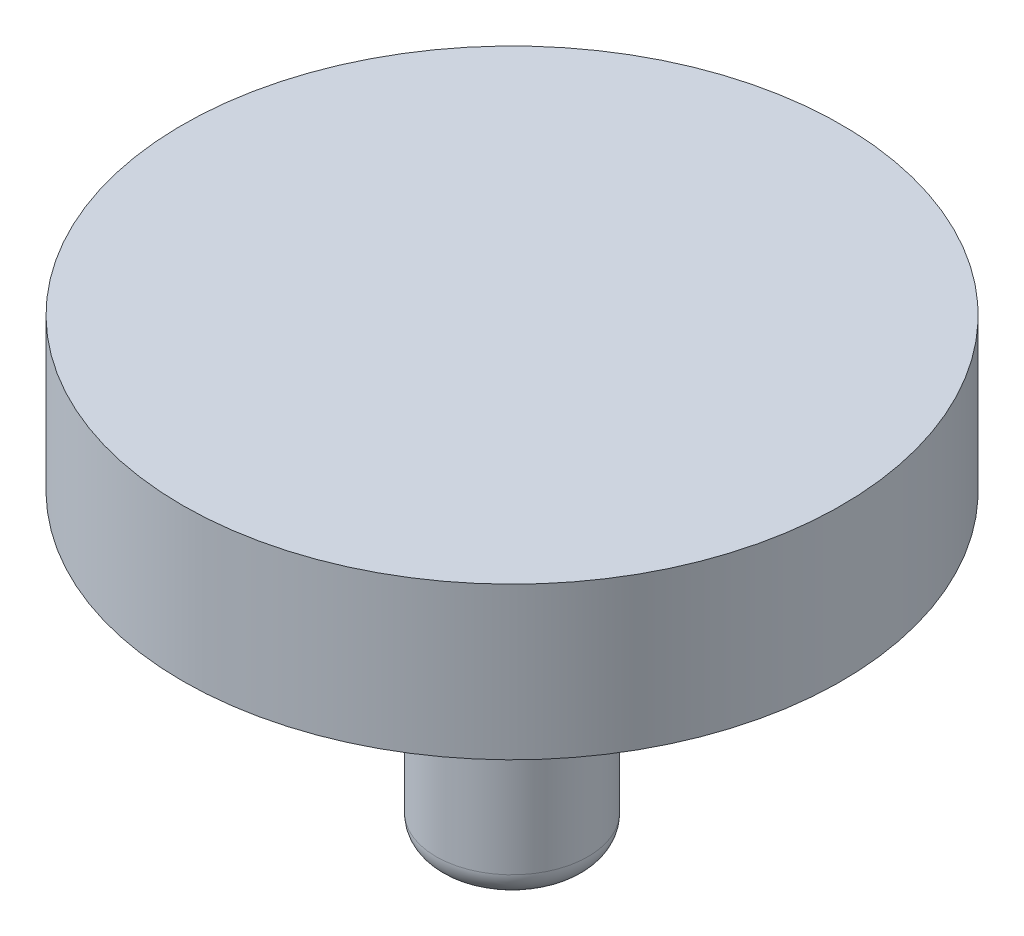
ISO-10303-21;
HEADER;
FILE_DESCRIPTION(('STEP AP214'),'2;1');
FILE_NAME('part.step','',(''),(''),'','','');
FILE_SCHEMA(('AUTOMOTIVE_DESIGN { 1 0 10303 214 1 1 1 1 }'));
ENDSEC;
DATA;
#1=APPLICATION_CONTEXT('core data for automotive mechanical design processes');
#2=APPLICATION_PROTOCOL_DEFINITION('international standard','automotive_design',2000,#1);
#3=PRODUCT_CONTEXT('',#1,'mechanical');
#4=PRODUCT('Part','Part','',(#3));
#5=PRODUCT_RELATED_PRODUCT_CATEGORY('part','',(#4));
#6=PRODUCT_DEFINITION_FORMATION('','',#4);
#7=PRODUCT_DEFINITION_CONTEXT('part definition',#1,'design');
#8=PRODUCT_DEFINITION('design','',#6,#7);
#9=PRODUCT_DEFINITION_SHAPE('','',#8);
#10=(LENGTH_UNIT() NAMED_UNIT(*) SI_UNIT(.MILLI.,.METRE.));
#11=(NAMED_UNIT(*) PLANE_ANGLE_UNIT() SI_UNIT($,.RADIAN.));
#12=(NAMED_UNIT(*) SI_UNIT($,.STERADIAN.) SOLID_ANGLE_UNIT());
#13=UNCERTAINTY_MEASURE_WITH_UNIT(LENGTH_MEASURE(1.E-05),#10,'distance_accuracy_value','');
#14=(GEOMETRIC_REPRESENTATION_CONTEXT(3) GLOBAL_UNCERTAINTY_ASSIGNED_CONTEXT((#13)) GLOBAL_UNIT_ASSIGNED_CONTEXT((#10,
#11,#12)) REPRESENTATION_CONTEXT('',''));
#15=CARTESIAN_POINT('',(0.,0.,0.));
#16=DIRECTION('',(0.,0.,1.));
#17=DIRECTION('',(1.,0.,0.));
#18=AXIS2_PLACEMENT_3D('',#15,#16,#17);
#19=CARTESIAN_POINT('',(0.,3.,0.));
#20=DIRECTION('',(0.,-1.,0.));
#21=DIRECTION('',(0.,0.,-1.));
#22=AXIS2_PLACEMENT_3D('',#19,#20,#21);
#23=CYLINDRICAL_SURFACE('',#22,6.5);
#24=CARTESIAN_POINT('',(0.,3.,0.));
#25=DIRECTION('',(0.,1.,0.));
#26=DIRECTION('',(0.,0.,1.));
#27=AXIS2_PLACEMENT_3D('',#24,#25,#26);
#28=CIRCLE('',#27,6.5);
#29=CARTESIAN_POINT('',(0.,3.,6.5));
#30=VERTEX_POINT('',#29);
#31=EDGE_CURVE('E50',#30,#30,#28,.T.);
#32=ORIENTED_EDGE('',*,*,#31,.F.);
#33=EDGE_LOOP('',(#32));
#34=FACE_BOUND('',#33,.T.);
#35=CARTESIAN_POINT('',(0.,0.,0.));
#36=DIRECTION('',(0.,1.,0.));
#37=DIRECTION('',(0.,0.,1.));
#38=AXIS2_PLACEMENT_3D('',#35,#36,#37);
#39=CIRCLE('',#38,6.5);
#40=CARTESIAN_POINT('',(0.,0.,6.5));
#41=VERTEX_POINT('',#40);
#42=EDGE_CURVE('E55',#41,#41,#39,.T.);
#43=ORIENTED_EDGE('',*,*,#42,.T.);
#44=EDGE_LOOP('',(#43));
#45=FACE_BOUND('',#44,.T.);
#46=ADVANCED_FACE('F37',(#34,#45),#23,.T.);
#47=CARTESIAN_POINT('',(0.,3.,0.));
#48=DIRECTION('',(0.,1.,0.));
#49=DIRECTION('',(0.,0.,1.));
#50=AXIS2_PLACEMENT_3D('',#47,#48,#49);
#51=PLANE('',#50);
#52=ORIENTED_EDGE('',*,*,#31,.T.);
#53=EDGE_LOOP('',(#52));
#54=FACE_BOUND('',#53,.T.);
#55=ADVANCED_FACE('F78',(#54),#51,.T.);
#56=CARTESIAN_POINT('',(0.,0.,0.));
#57=DIRECTION('',(0.,1.,0.));
#58=DIRECTION('',(0.,0.,1.));
#59=AXIS2_PLACEMENT_3D('',#56,#57,#58);
#60=PLANE('',#59);
#61=CARTESIAN_POINT('',(0.,0.,0.));
#62=DIRECTION('',(0.,1.,0.));
#63=DIRECTION('',(0.,0.,1.));
#64=AXIS2_PLACEMENT_3D('',#61,#62,#63);
#65=CIRCLE('',#64,1.5);
#66=CARTESIAN_POINT('',(0.,0.,1.5));
#67=VERTEX_POINT('',#66);
#68=EDGE_CURVE('E60',#67,#67,#65,.T.);
#69=ORIENTED_EDGE('',*,*,#68,.T.);
#70=EDGE_LOOP('',(#69));
#71=FACE_BOUND('',#70,.T.);
#72=ORIENTED_EDGE('',*,*,#42,.F.);
#73=EDGE_LOOP('',(#72));
#74=FACE_BOUND('',#73,.T.);
#75=ADVANCED_FACE('F66',(#71,#74),#60,.F.);
#76=CARTESIAN_POINT('',(0.,-6.,0.));
#77=DIRECTION('',(0.,1.,0.));
#78=DIRECTION('',(0.,0.,1.));
#79=AXIS2_PLACEMENT_3D('',#76,#77,#78);
#80=CYLINDRICAL_SURFACE('',#79,1.5);
#81=CARTESIAN_POINT('',(0.,-5.5,0.));
#82=DIRECTION('',(0.,1.,0.));
#83=DIRECTION('',(0.,0.,1.));
#84=AXIS2_PLACEMENT_3D('',#81,#82,#83);
#85=CIRCLE('',#84,1.5);
#86=CARTESIAN_POINT('',(0.,-5.5,1.5));
#87=VERTEX_POINT('',#86);
#88=EDGE_CURVE('E45',#87,#87,#85,.T.);
#89=ORIENTED_EDGE('',*,*,#88,.T.);
#90=EDGE_LOOP('',(#89));
#91=FACE_BOUND('',#90,.T.);
#92=ORIENTED_EDGE('',*,*,#68,.F.);
#93=EDGE_LOOP('',(#92));
#94=FACE_BOUND('',#93,.T.);
#95=ADVANCED_FACE('F69',(#91,#94),#80,.T.);
#96=CARTESIAN_POINT('',(0.,-6.,0.));
#97=DIRECTION('',(0.,1.,0.));
#98=DIRECTION('',(0.,0.,1.));
#99=AXIS2_PLACEMENT_3D('',#96,#97,#98);
#100=PLANE('',#99);
#101=CARTESIAN_POINT('',(0.,-6.,0.));
#102=DIRECTION('',(0.,1.,0.));
#103=DIRECTION('',(0.,0.,1.));
#104=AXIS2_PLACEMENT_3D('',#101,#102,#103);
#105=CIRCLE('',#104,1.);
#106=CARTESIAN_POINT('',(0.,-6.,1.));
#107=VERTEX_POINT('',#106);
#108=EDGE_CURVE('E10',#107,#107,#105,.F.);
#109=ORIENTED_EDGE('',*,*,#108,.T.);
#110=EDGE_LOOP('',(#109));
#111=FACE_BOUND('',#110,.T.);
#112=ADVANCED_FACE('F71',(#111),#100,.F.);
#113=CARTESIAN_POINT('',(0.,-5.5,0.));
#114=DIRECTION('',(0.,1.,0.));
#115=DIRECTION('',(0.,0.,1.));
#116=AXIS2_PLACEMENT_3D('',#113,#114,#115);
#117=TOROIDAL_SURFACE('',#116,1.,0.5);
#118=ORIENTED_EDGE('',*,*,#108,.F.);
#119=EDGE_LOOP('',(#118));
#120=FACE_BOUND('',#119,.T.);
#121=ORIENTED_EDGE('',*,*,#88,.F.);
#122=EDGE_LOOP('',(#121));
#123=FACE_BOUND('',#122,.T.);
#124=ADVANCED_FACE('F39',(#120,#123),#117,.T.);
#125=CLOSED_SHELL('',(#46,#55,#75,#95,#112,#124));
#126=MANIFOLD_SOLID_BREP('B2',#125);
#127=ADVANCED_BREP_SHAPE_REPRESENTATION('',(#18,#126),#14);
#128=SHAPE_DEFINITION_REPRESENTATION(#9,#127);
ENDSEC;
END-ISO-10303-21;
